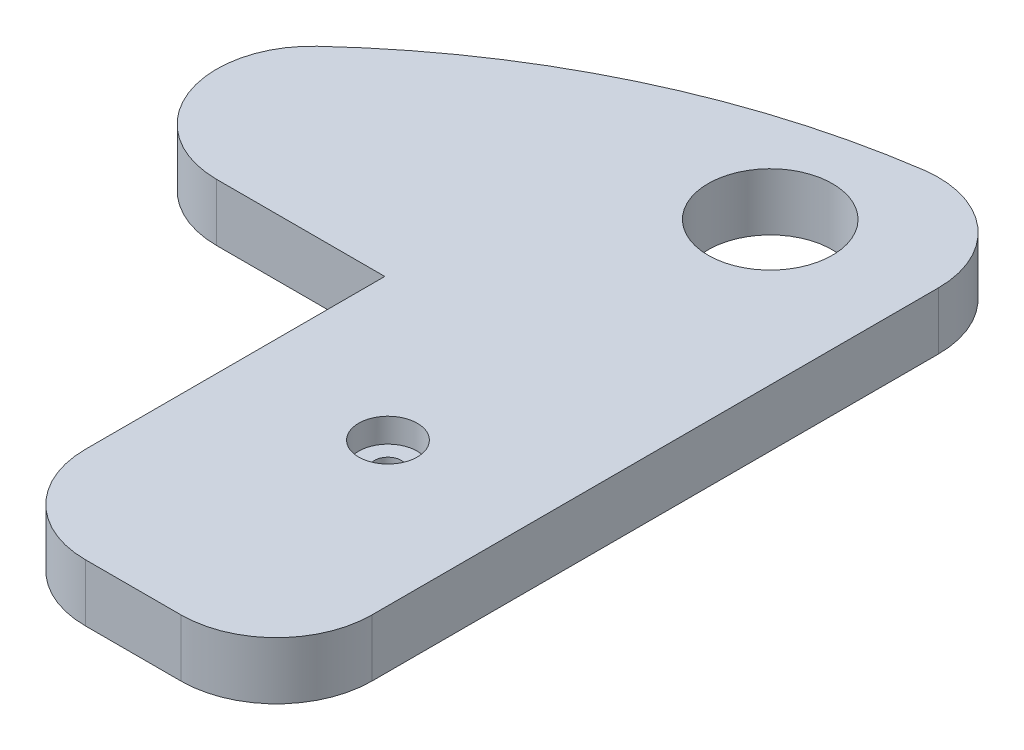
ISO-10303-21;
HEADER;
FILE_DESCRIPTION(('STEP AP214'),'2;1');
FILE_NAME('part.step','',(''),(''),'','','');
FILE_SCHEMA(('AUTOMOTIVE_DESIGN { 1 0 10303 214 1 1 1 1 }'));
ENDSEC;
DATA;
#1=APPLICATION_CONTEXT('core data for automotive mechanical design processes');
#2=APPLICATION_PROTOCOL_DEFINITION('international standard','automotive_design',2000,#1);
#3=PRODUCT_CONTEXT('',#1,'mechanical');
#4=PRODUCT('Part','Part','',(#3));
#5=PRODUCT_RELATED_PRODUCT_CATEGORY('part','',(#4));
#6=PRODUCT_DEFINITION_FORMATION('','',#4);
#7=PRODUCT_DEFINITION_CONTEXT('part definition',#1,'design');
#8=PRODUCT_DEFINITION('design','',#6,#7);
#9=PRODUCT_DEFINITION_SHAPE('','',#8);
#10=(LENGTH_UNIT() NAMED_UNIT(*) SI_UNIT(.MILLI.,.METRE.));
#11=(NAMED_UNIT(*) PLANE_ANGLE_UNIT() SI_UNIT($,.RADIAN.));
#12=(NAMED_UNIT(*) SI_UNIT($,.STERADIAN.) SOLID_ANGLE_UNIT());
#13=UNCERTAINTY_MEASURE_WITH_UNIT(LENGTH_MEASURE(1.E-05),#10,'distance_accuracy_value','');
#14=(GEOMETRIC_REPRESENTATION_CONTEXT(3) GLOBAL_UNCERTAINTY_ASSIGNED_CONTEXT((#13)) GLOBAL_UNIT_ASSIGNED_CONTEXT((#10,
#11,#12)) REPRESENTATION_CONTEXT('',''));
#15=CARTESIAN_POINT('',(0.,0.,0.));
#16=DIRECTION('',(0.,0.,1.));
#17=DIRECTION('',(1.,0.,0.));
#18=AXIS2_PLACEMENT_3D('',#15,#16,#17);
#19=CARTESIAN_POINT('',(-11.25,4.5,30.));
#20=DIRECTION('',(0.,0.,-1.));
#21=DIRECTION('',(-1.,0.,0.));
#22=AXIS2_PLACEMENT_3D('',#19,#20,#21);
#23=PLANE('',#22);
#24=DIRECTION('',(1.,0.,0.));
#25=VECTOR('',#24,1.);
#26=CARTESIAN_POINT('',(-11.25,0.,30.));
#27=LINE('',#26,#25);
#28=CARTESIAN_POINT('',(-3.75,0.,30.));
#29=VERTEX_POINT('',#28);
#30=CARTESIAN_POINT('',(3.74999999999999,0.,30.));
#31=VERTEX_POINT('',#30);
#32=EDGE_CURVE('E342',#29,#31,#27,.T.);
#33=ORIENTED_EDGE('',*,*,#32,.T.);
#34=DIRECTION('',(0.,-1.,0.));
#35=VECTOR('',#34,1.);
#36=CARTESIAN_POINT('',(3.75,4.5,30.));
#37=LINE('',#36,#35);
#38=CARTESIAN_POINT('',(3.74999999999999,4.5,30.));
#39=VERTEX_POINT('',#38);
#40=EDGE_CURVE('E48',#31,#39,#37,.F.);
#41=ORIENTED_EDGE('',*,*,#40,.T.);
#42=DIRECTION('',(1.,0.,0.));
#43=VECTOR('',#42,1.);
#44=CARTESIAN_POINT('',(-11.25,4.5,30.));
#45=LINE('',#44,#43);
#46=CARTESIAN_POINT('',(-3.75,4.5,30.));
#47=VERTEX_POINT('',#46);
#48=EDGE_CURVE('E341',#47,#39,#45,.T.);
#49=ORIENTED_EDGE('',*,*,#48,.F.);
#50=DIRECTION('',(0.,1.,0.));
#51=VECTOR('',#50,1.);
#52=CARTESIAN_POINT('',(-3.75,0.,30.));
#53=LINE('',#52,#51);
#54=EDGE_CURVE('E411',#47,#29,#53,.F.);
#55=ORIENTED_EDGE('',*,*,#54,.T.);
#56=EDGE_LOOP('',(#33,#41,#49,#55));
#57=FACE_BOUND('',#56,.T.);
#58=ADVANCED_FACE('F40',(#57),#23,.F.);
#59=CARTESIAN_POINT('',(0.,4.5,0.));
#60=DIRECTION('',(0.,-1.,0.));
#61=DIRECTION('',(0.,0.,-1.));
#62=AXIS2_PLACEMENT_3D('',#59,#60,#61);
#63=PLANE('',#62);
#64=CARTESIAN_POINT('',(0.,4.5,10.));
#65=DIRECTION('',(0.,1.,0.));
#66=DIRECTION('',(0.,0.,1.));
#67=AXIS2_PLACEMENT_3D('',#64,#65,#66);
#68=CIRCLE('',#67,2.3);
#69=CARTESIAN_POINT('',(0.,4.5,12.3));
#70=VERTEX_POINT('',#69);
#71=EDGE_CURVE('E248',#70,#70,#68,.T.);
#72=ORIENTED_EDGE('',*,*,#71,.F.);
#73=EDGE_LOOP('',(#72));
#74=FACE_BOUND('',#73,.T.);
#75=CARTESIAN_POINT('',(0.,4.5,-20.));
#76=DIRECTION('',(0.,1.,0.));
#77=DIRECTION('',(0.,0.,1.));
#78=AXIS2_PLACEMENT_3D('',#75,#76,#77);
#79=CIRCLE('',#78,4.875);
#80=CARTESIAN_POINT('',(0.,4.5,-15.125));
#81=VERTEX_POINT('',#80);
#82=EDGE_CURVE('E231',#81,#81,#79,.T.);
#83=ORIENTED_EDGE('',*,*,#82,.F.);
#84=EDGE_LOOP('',(#83));
#85=FACE_BOUND('',#84,.T.);
#86=DIRECTION('',(0.,0.,-1.));
#87=VECTOR('',#86,1.);
#88=CARTESIAN_POINT('',(11.25,4.5,30.));
#89=LINE('',#88,#87);
#90=CARTESIAN_POINT('',(11.25,4.5,22.5));
#91=VERTEX_POINT('',#90);
#92=CARTESIAN_POINT('',(11.25,4.5,-21.9615242270663));
#93=VERTEX_POINT('',#92);
#94=EDGE_CURVE('E339',#91,#93,#89,.T.);
#95=ORIENTED_EDGE('',*,*,#94,.T.);
#96=CARTESIAN_POINT('',(3.75,4.5,-21.9615242270663));
#97=DIRECTION('',(0.,-1.,0.));
#98=DIRECTION('',(0.,0.,-1.));
#99=AXIS2_PLACEMENT_3D('',#96,#97,#98);
#100=CIRCLE('',#99,7.5);
#101=CARTESIAN_POINT('',(2.67857142857143,4.5,-29.3845991166472));
#102=VERTEX_POINT('',#101);
#103=EDGE_CURVE('E409',#93,#102,#100,.F.);
#104=ORIENTED_EDGE('',*,*,#103,.T.);
#105=CARTESIAN_POINT('',(11.25,4.5,30.));
#106=DIRECTION('',(0.,1.,0.));
#107=DIRECTION('',(0.,0.,1.));
#108=AXIS2_PLACEMENT_3D('',#105,#106,#107);
#109=CIRCLE('',#108,60.);
#110=CARTESIAN_POINT('',(-29.5421561087423,4.5,-14.));
#111=VERTEX_POINT('',#110);
#112=EDGE_CURVE('E238',#102,#111,#109,.T.);
#113=ORIENTED_EDGE('',*,*,#112,.T.);
#114=CARTESIAN_POINT('',(-24.4431365951495,4.5,-8.49999999999999));
#115=DIRECTION('',(0.,-1.,0.));
#116=DIRECTION('',(0.,0.,-1.));
#117=AXIS2_PLACEMENT_3D('',#114,#115,#116);
#118=CIRCLE('',#117,7.5);
#119=CARTESIAN_POINT('',(-24.4431365951495,4.5,-0.999999999999994));
#120=VERTEX_POINT('',#119);
#121=EDGE_CURVE('E212',#111,#120,#118,.F.);
#122=ORIENTED_EDGE('',*,*,#121,.T.);
#123=DIRECTION('',(1.,0.,0.));
#124=VECTOR('',#123,1.);
#125=CARTESIAN_POINT('',(0.,4.5,-0.999999999999994));
#126=LINE('',#125,#124);
#127=CARTESIAN_POINT('',(-11.25,4.5,-0.999999999999994));
#128=VERTEX_POINT('',#127);
#129=EDGE_CURVE('E205',#120,#128,#126,.T.);
#130=ORIENTED_EDGE('',*,*,#129,.T.);
#131=DIRECTION('',(0.,0.,1.));
#132=VECTOR('',#131,1.);
#133=CARTESIAN_POINT('',(-11.25,4.5,0.));
#134=LINE('',#133,#132);
#135=CARTESIAN_POINT('',(-11.25,4.5,22.5));
#136=VERTEX_POINT('',#135);
#137=EDGE_CURVE('E210',#128,#136,#134,.T.);
#138=ORIENTED_EDGE('',*,*,#137,.T.);
#139=CARTESIAN_POINT('',(-3.75,4.5,22.5));
#140=DIRECTION('',(0.,-1.,0.));
#141=DIRECTION('',(0.,0.,-1.));
#142=AXIS2_PLACEMENT_3D('',#139,#140,#141);
#143=CIRCLE('',#142,7.5);
#144=EDGE_CURVE('E61',#136,#47,#143,.F.);
#145=ORIENTED_EDGE('',*,*,#144,.T.);
#146=ORIENTED_EDGE('',*,*,#48,.T.);
#147=CARTESIAN_POINT('',(3.75,4.5,22.5));
#148=DIRECTION('',(0.,-1.,0.));
#149=DIRECTION('',(0.,0.,-1.));
#150=AXIS2_PLACEMENT_3D('',#147,#148,#149);
#151=CIRCLE('',#150,7.5);
#152=EDGE_CURVE('E407',#39,#91,#151,.F.);
#153=ORIENTED_EDGE('',*,*,#152,.T.);
#154=EDGE_LOOP('',(#95,#104,#113,#122,#130,#138,#145,#146,#153));
#155=FACE_BOUND('',#154,.T.);
#156=ADVANCED_FACE('F208',(#74,#85,#155),#63,.F.);
#157=CARTESIAN_POINT('',(0.,0.,0.));
#158=DIRECTION('',(0.,-1.,0.));
#159=DIRECTION('',(0.,0.,-1.));
#160=AXIS2_PLACEMENT_3D('',#157,#158,#159);
#161=PLANE('',#160);
#162=CARTESIAN_POINT('',(0.,0.,-20.));
#163=DIRECTION('',(0.,-1.,0.));
#164=DIRECTION('',(0.,0.,-1.));
#165=AXIS2_PLACEMENT_3D('',#162,#163,#164);
#166=CIRCLE('',#165,4.875);
#167=CARTESIAN_POINT('',(0.,0.,-15.125));
#168=VERTEX_POINT('',#167);
#169=EDGE_CURVE('E235',#168,#168,#166,.F.);
#170=ORIENTED_EDGE('',*,*,#169,.T.);
#171=EDGE_LOOP('',(#170));
#172=FACE_BOUND('',#171,.T.);
#173=DIRECTION('',(-1.,0.,0.));
#174=VECTOR('',#173,1.);
#175=CARTESIAN_POINT('',(-7.24233902206816,0.,12.25));
#176=LINE('',#175,#174);
#177=CARTESIAN_POINT('',(-4.19869740362329,0.,12.25));
#178=VERTEX_POINT('',#177);
#179=CARTESIAN_POINT('',(-7.24233902206816,0.,12.25));
#180=VERTEX_POINT('',#179);
#181=EDGE_CURVE('E304',#178,#180,#176,.T.);
#182=ORIENTED_EDGE('',*,*,#181,.F.);
#183=CARTESIAN_POINT('',(-4.19869740362329,0.,13.25));
#184=DIRECTION('',(0.,-1.,0.));
#185=DIRECTION('',(0.,0.,-1.));
#186=AXIS2_PLACEMENT_3D('',#183,#184,#185);
#187=CIRCLE('',#186,1.);
#188=CARTESIAN_POINT('',(-3.20250270553154,0.,13.1628442572524));
#189=VERTEX_POINT('',#188);
#190=EDGE_CURVE('E356',#178,#189,#187,.T.);
#191=ORIENTED_EDGE('',*,*,#190,.T.);
#192=DIRECTION('',(-0.0871557427476553,0.,-0.996194698091746));
#193=VECTOR('',#192,1.);
#194=CARTESIAN_POINT('',(-3.28236622960586,0.,12.25));
#195=LINE('',#194,#193);
#196=CARTESIAN_POINT('',(-2.25,0.,24.05));
#197=VERTEX_POINT('',#196);
#198=EDGE_CURVE('E301',#197,#189,#195,.T.);
#199=ORIENTED_EDGE('',*,*,#198,.F.);
#200=CARTESIAN_POINT('',(0.,0.,24.05));
#201=DIRECTION('',(0.,-1.,0.));
#202=DIRECTION('',(0.,0.,-1.));
#203=AXIS2_PLACEMENT_3D('',#200,#201,#202);
#204=CIRCLE('',#203,2.25);
#205=CARTESIAN_POINT('',(2.25,0.,24.05));
#206=VERTEX_POINT('',#205);
#207=EDGE_CURVE('E298',#206,#197,#204,.T.);
#208=ORIENTED_EDGE('',*,*,#207,.F.);
#209=DIRECTION('',(-0.0871557427476538,0.,0.996194698091746));
#210=VECTOR('',#209,1.);
#211=CARTESIAN_POINT('',(3.28236622960585,0.,12.25));
#212=LINE('',#211,#210);
#213=CARTESIAN_POINT('',(3.20250270553153,0.,13.1628442572524));
#214=VERTEX_POINT('',#213);
#215=EDGE_CURVE('E296',#214,#206,#212,.T.);
#216=ORIENTED_EDGE('',*,*,#215,.F.);
#217=CARTESIAN_POINT('',(4.19869740362328,0.,13.25));
#218=DIRECTION('',(0.,-1.,0.));
#219=DIRECTION('',(0.,0.,-1.));
#220=AXIS2_PLACEMENT_3D('',#217,#218,#219);
#221=CIRCLE('',#220,1.);
#222=CARTESIAN_POINT('',(4.19869740362328,0.,12.25));
#223=VERTEX_POINT('',#222);
#224=EDGE_CURVE('E350',#214,#223,#221,.T.);
#225=ORIENTED_EDGE('',*,*,#224,.T.);
#226=DIRECTION('',(-1.,0.,0.));
#227=VECTOR('',#226,1.);
#228=CARTESIAN_POINT('',(7.24233902206817,0.,12.25));
#229=LINE('',#228,#227);
#230=CARTESIAN_POINT('',(7.24233902206817,0.,12.25));
#231=VERTEX_POINT('',#230);
#232=EDGE_CURVE('E293',#231,#223,#229,.T.);
#233=ORIENTED_EDGE('',*,*,#232,.F.);
#234=CARTESIAN_POINT('',(7.24233902206817,0.,10.));
#235=DIRECTION('',(0.,-1.,0.));
#236=DIRECTION('',(0.,0.,-1.));
#237=AXIS2_PLACEMENT_3D('',#234,#235,#236);
#238=CIRCLE('',#237,2.25);
#239=CARTESIAN_POINT('',(7.24233902206817,0.,7.75000000000001));
#240=VERTEX_POINT('',#239);
#241=EDGE_CURVE('E290',#240,#231,#238,.T.);
#242=ORIENTED_EDGE('',*,*,#241,.F.);
#243=DIRECTION('',(1.,0.,0.));
#244=VECTOR('',#243,1.);
#245=CARTESIAN_POINT('',(3.49233902206817,0.,7.75000000000001));
#246=LINE('',#245,#244);
#247=CARTESIAN_POINT('',(4.40867019608559,0.,7.75000000000001));
#248=VERTEX_POINT('',#247);
#249=EDGE_CURVE('E254',#248,#240,#246,.T.);
#250=ORIENTED_EDGE('',*,*,#249,.F.);
#251=CARTESIAN_POINT('',(4.40867019608559,0.,6.75000000000001));
#252=DIRECTION('',(0.,-1.,0.));
#253=DIRECTION('',(0.,0.,-1.));
#254=AXIS2_PLACEMENT_3D('',#251,#252,#253);
#255=CIRCLE('',#254,1.);
#256=CARTESIAN_POINT('',(3.41247549799385,0.,6.83715574274767));
#257=VERTEX_POINT('',#256);
#258=EDGE_CURVE('E352',#248,#257,#255,.T.);
#259=ORIENTED_EDGE('',*,*,#258,.T.);
#260=DIRECTION('',(0.0871557427476615,0.,0.996194698091745));
#261=VECTOR('',#260,1.);
#262=CARTESIAN_POINT('',(3.49233902206817,0.,7.75000000000001));
#263=LINE('',#262,#261);
#264=CARTESIAN_POINT('',(2.25,0.,-6.45));
#265=VERTEX_POINT('',#264);
#266=EDGE_CURVE('E258',#265,#257,#263,.T.);
#267=ORIENTED_EDGE('',*,*,#266,.F.);
#268=CARTESIAN_POINT('',(0.,0.,-6.44999999999999));
#269=DIRECTION('',(0.,-1.,0.));
#270=DIRECTION('',(0.,0.,-1.));
#271=AXIS2_PLACEMENT_3D('',#268,#269,#270);
#272=CIRCLE('',#271,2.25);
#273=CARTESIAN_POINT('',(-2.25,0.,-6.45));
#274=VERTEX_POINT('',#273);
#275=EDGE_CURVE('E314',#274,#265,#272,.T.);
#276=ORIENTED_EDGE('',*,*,#275,.F.);
#277=DIRECTION('',(0.0871557427476544,0.,-0.996194698091746));
#278=VECTOR('',#277,1.);
#279=CARTESIAN_POINT('',(-2.25,0.,-6.45));
#280=LINE('',#279,#278);
#281=CARTESIAN_POINT('',(-3.41247549799374,0.,6.83715574274766));
#282=VERTEX_POINT('',#281);
#283=EDGE_CURVE('E312',#282,#274,#280,.T.);
#284=ORIENTED_EDGE('',*,*,#283,.F.);
#285=CARTESIAN_POINT('',(-4.40867019608549,0.,6.75000000000001));
#286=DIRECTION('',(0.,-1.,0.));
#287=DIRECTION('',(0.,0.,-1.));
#288=AXIS2_PLACEMENT_3D('',#285,#286,#287);
#289=CIRCLE('',#288,1.);
#290=CARTESIAN_POINT('',(-4.40867019608549,0.,7.75));
#291=VERTEX_POINT('',#290);
#292=EDGE_CURVE('E354',#282,#291,#289,.T.);
#293=ORIENTED_EDGE('',*,*,#292,.T.);
#294=DIRECTION('',(1.,0.,0.));
#295=VECTOR('',#294,1.);
#296=CARTESIAN_POINT('',(-3.49233902206806,0.,7.75));
#297=LINE('',#296,#295);
#298=CARTESIAN_POINT('',(-7.24233902206816,0.,7.75000000000001));
#299=VERTEX_POINT('',#298);
#300=EDGE_CURVE('E309',#299,#291,#297,.T.);
#301=ORIENTED_EDGE('',*,*,#300,.F.);
#302=CARTESIAN_POINT('',(-7.24233902206816,0.,10.));
#303=DIRECTION('',(0.,-1.,0.));
#304=DIRECTION('',(0.,0.,-1.));
#305=AXIS2_PLACEMENT_3D('',#302,#303,#304);
#306=CIRCLE('',#305,2.25);
#307=EDGE_CURVE('E306',#180,#299,#306,.T.);
#308=ORIENTED_EDGE('',*,*,#307,.F.);
#309=EDGE_LOOP('',(#182,#191,#199,#208,#216,#225,#233,#242,#250,#259,#267,#276,#284,#293,#301,#308));
#310=FACE_BOUND('',#309,.T.);
#311=CARTESIAN_POINT('',(11.25,0.,30.));
#312=DIRECTION('',(0.,-1.,0.));
#313=DIRECTION('',(0.,0.,-1.));
#314=AXIS2_PLACEMENT_3D('',#311,#312,#313);
#315=CIRCLE('',#314,60.);
#316=CARTESIAN_POINT('',(2.67857142857143,0.,-29.3845991166472));
#317=VERTEX_POINT('',#316);
#318=CARTESIAN_POINT('',(-29.5421561087423,0.,-14.));
#319=VERTEX_POINT('',#318);
#320=EDGE_CURVE('E240',#317,#319,#315,.F.);
#321=ORIENTED_EDGE('',*,*,#320,.F.);
#322=CARTESIAN_POINT('',(3.75,0.,-21.9615242270663));
#323=DIRECTION('',(0.,-1.,0.));
#324=DIRECTION('',(0.,0.,-1.));
#325=AXIS2_PLACEMENT_3D('',#322,#323,#324);
#326=CIRCLE('',#325,7.5);
#327=CARTESIAN_POINT('',(11.25,0.,-21.9615242270663));
#328=VERTEX_POINT('',#327);
#329=EDGE_CURVE('E399',#317,#328,#326,.T.);
#330=ORIENTED_EDGE('',*,*,#329,.T.);
#331=DIRECTION('',(0.,0.,-1.));
#332=VECTOR('',#331,1.);
#333=CARTESIAN_POINT('',(11.25,0.,30.));
#334=LINE('',#333,#332);
#335=CARTESIAN_POINT('',(11.25,0.,22.5));
#336=VERTEX_POINT('',#335);
#337=EDGE_CURVE('E321',#336,#328,#334,.T.);
#338=ORIENTED_EDGE('',*,*,#337,.F.);
#339=CARTESIAN_POINT('',(3.75,0.,22.5));
#340=DIRECTION('',(0.,-1.,0.));
#341=DIRECTION('',(0.,0.,-1.));
#342=AXIS2_PLACEMENT_3D('',#339,#340,#341);
#343=CIRCLE('',#342,7.5);
#344=EDGE_CURVE('E397',#336,#31,#343,.T.);
#345=ORIENTED_EDGE('',*,*,#344,.T.);
#346=ORIENTED_EDGE('',*,*,#32,.F.);
#347=CARTESIAN_POINT('',(-3.75,0.,22.5));
#348=DIRECTION('',(0.,-1.,0.));
#349=DIRECTION('',(0.,0.,-1.));
#350=AXIS2_PLACEMENT_3D('',#347,#348,#349);
#351=CIRCLE('',#350,7.5);
#352=CARTESIAN_POINT('',(-11.25,0.,22.5));
#353=VERTEX_POINT('',#352);
#354=EDGE_CURVE('E395',#29,#353,#351,.T.);
#355=ORIENTED_EDGE('',*,*,#354,.T.);
#356=DIRECTION('',(0.,0.,1.));
#357=VECTOR('',#356,1.);
#358=CARTESIAN_POINT('',(-11.25,0.,0.));
#359=LINE('',#358,#357);
#360=CARTESIAN_POINT('',(-11.25,0.,-0.999999999999994));
#361=VERTEX_POINT('',#360);
#362=EDGE_CURVE('E229',#361,#353,#359,.T.);
#363=ORIENTED_EDGE('',*,*,#362,.F.);
#364=DIRECTION('',(1.,0.,0.));
#365=VECTOR('',#364,1.);
#366=CARTESIAN_POINT('',(0.,0.,-0.999999999999994));
#367=LINE('',#366,#365);
#368=CARTESIAN_POINT('',(-24.4431365951495,0.,-0.999999999999994));
#369=VERTEX_POINT('',#368);
#370=EDGE_CURVE('E215',#369,#361,#367,.T.);
#371=ORIENTED_EDGE('',*,*,#370,.F.);
#372=CARTESIAN_POINT('',(-24.4431365951495,0.,-8.49999999999999));
#373=DIRECTION('',(0.,-1.,0.));
#374=DIRECTION('',(0.,0.,-1.));
#375=AXIS2_PLACEMENT_3D('',#372,#373,#374);
#376=CIRCLE('',#375,7.5);
#377=EDGE_CURVE('E389',#369,#319,#376,.T.);
#378=ORIENTED_EDGE('',*,*,#377,.T.);
#379=EDGE_LOOP('',(#321,#330,#338,#345,#346,#355,#363,#371,#378));
#380=FACE_BOUND('',#379,.T.);
#381=ADVANCED_FACE('F418',(#172,#310,#380),#161,.T.);
#382=CARTESIAN_POINT('',(11.25,-67.0820393249937,30.));
#383=DIRECTION('',(0.,1.,0.));
#384=DIRECTION('',(0.,0.,1.));
#385=AXIS2_PLACEMENT_3D('',#382,#383,#384);
#386=CYLINDRICAL_SURFACE('',#385,60.);
#387=ORIENTED_EDGE('',*,*,#112,.F.);
#388=DIRECTION('',(0.,1.,0.));
#389=VECTOR('',#388,1.);
#390=CARTESIAN_POINT('',(2.67857142857143,-67.0820393249937,-29.3845991166472));
#391=LINE('',#390,#389);
#392=EDGE_CURVE('E392',#102,#317,#391,.F.);
#393=ORIENTED_EDGE('',*,*,#392,.T.);
#394=ORIENTED_EDGE('',*,*,#320,.T.);
#395=DIRECTION('',(0.,1.,0.));
#396=VECTOR('',#395,1.);
#397=CARTESIAN_POINT('',(-29.5421561087423,-67.0820393249937,-14.));
#398=LINE('',#397,#396);
#399=EDGE_CURVE('E383',#319,#111,#398,.T.);
#400=ORIENTED_EDGE('',*,*,#399,.T.);
#401=EDGE_LOOP('',(#387,#393,#394,#400));
#402=FACE_BOUND('',#401,.T.);
#403=ADVANCED_FACE('F440',(#402),#386,.T.);
#404=CARTESIAN_POINT('',(11.25,4.5,30.));
#405=DIRECTION('',(-1.,0.,0.));
#406=DIRECTION('',(0.,0.,1.));
#407=AXIS2_PLACEMENT_3D('',#404,#405,#406);
#408=PLANE('',#407);
#409=ORIENTED_EDGE('',*,*,#337,.T.);
#410=DIRECTION('',(0.,-1.,0.));
#411=VECTOR('',#410,1.);
#412=CARTESIAN_POINT('',(11.25,4.5,-21.9615242270663));
#413=LINE('',#412,#411);
#414=EDGE_CURVE('E404',#328,#93,#413,.F.);
#415=ORIENTED_EDGE('',*,*,#414,.T.);
#416=ORIENTED_EDGE('',*,*,#94,.F.);
#417=DIRECTION('',(0.,-1.,0.));
#418=VECTOR('',#417,1.);
#419=CARTESIAN_POINT('',(11.25,4.5,22.5));
#420=LINE('',#419,#418);
#421=EDGE_CURVE('E401',#91,#336,#420,.T.);
#422=ORIENTED_EDGE('',*,*,#421,.T.);
#423=EDGE_LOOP('',(#409,#415,#416,#422));
#424=FACE_BOUND('',#423,.T.);
#425=ADVANCED_FACE('F436',(#424),#408,.F.);
#426=CARTESIAN_POINT('',(3.49233902206817,1.6,7.75000000000001));
#427=DIRECTION('',(0.,0.,-1.));
#428=DIRECTION('',(-1.,0.,0.));
#429=AXIS2_PLACEMENT_3D('',#426,#427,#428);
#430=PLANE('',#429);
#431=DIRECTION('',(1.,0.,0.));
#432=VECTOR('',#431,1.);
#433=CARTESIAN_POINT('',(3.49233902206817,1.6,7.75000000000001));
#434=LINE('',#433,#432);
#435=CARTESIAN_POINT('',(4.40867019608559,1.6,7.75000000000001));
#436=VERTEX_POINT('',#435);
#437=CARTESIAN_POINT('',(7.24233902206817,1.6,7.75000000000001));
#438=VERTEX_POINT('',#437);
#439=EDGE_CURVE('E255',#436,#438,#434,.T.);
#440=ORIENTED_EDGE('',*,*,#439,.F.);
#441=DIRECTION('',(0.,-1.,0.));
#442=VECTOR('',#441,1.);
#443=CARTESIAN_POINT('',(4.40867019608559,1.6,7.75000000000001));
#444=LINE('',#443,#442);
#445=EDGE_CURVE('E365',#436,#248,#444,.T.);
#446=ORIENTED_EDGE('',*,*,#445,.T.);
#447=ORIENTED_EDGE('',*,*,#249,.T.);
#448=DIRECTION('',(0.,-1.,0.));
#449=VECTOR('',#448,1.);
#450=CARTESIAN_POINT('',(7.24233902206817,1.6,7.75000000000001));
#451=LINE('',#450,#449);
#452=EDGE_CURVE('E288',#438,#240,#451,.T.);
#453=ORIENTED_EDGE('',*,*,#452,.F.);
#454=EDGE_LOOP('',(#440,#446,#447,#453));
#455=FACE_BOUND('',#454,.T.);
#456=ADVANCED_FACE('F439',(#455),#430,.F.);
#457=CARTESIAN_POINT('',(3.49233902206817,1.6,7.75000000000001));
#458=DIRECTION('',(0.996194698091745,0.,-0.0871557427476615));
#459=DIRECTION('',(-0.0871557427476615,0.,-0.996194698091745));
#460=AXIS2_PLACEMENT_3D('',#457,#458,#459);
#461=PLANE('',#460);
#462=ORIENTED_EDGE('',*,*,#266,.T.);
#463=DIRECTION('',(0.,-1.,0.));
#464=VECTOR('',#463,1.);
#465=CARTESIAN_POINT('',(3.41247549799385,1.6,6.83715574274767));
#466=LINE('',#465,#464);
#467=CARTESIAN_POINT('',(3.41247549799385,1.6,6.83715574274767));
#468=VERTEX_POINT('',#467);
#469=EDGE_CURVE('E368',#257,#468,#466,.F.);
#470=ORIENTED_EDGE('',*,*,#469,.T.);
#471=DIRECTION('',(0.0871557427476615,0.,0.996194698091745));
#472=VECTOR('',#471,1.);
#473=CARTESIAN_POINT('',(3.49233902206817,1.6,7.75000000000001));
#474=LINE('',#473,#472);
#475=CARTESIAN_POINT('',(2.25,1.6,-6.45));
#476=VERTEX_POINT('',#475);
#477=EDGE_CURVE('E285',#476,#468,#474,.T.);
#478=ORIENTED_EDGE('',*,*,#477,.F.);
#479=DIRECTION('',(0.,-1.,0.));
#480=VECTOR('',#479,1.);
#481=CARTESIAN_POINT('',(2.25,1.6,-6.45));
#482=LINE('',#481,#480);
#483=EDGE_CURVE('E319',#476,#265,#482,.T.);
#484=ORIENTED_EDGE('',*,*,#483,.T.);
#485=EDGE_LOOP('',(#462,#470,#478,#484));
#486=FACE_BOUND('',#485,.T.);
#487=ADVANCED_FACE('F503',(#486),#461,.F.);
#488=CARTESIAN_POINT('',(0.,1.6,-6.44999999999999));
#489=DIRECTION('',(0.,-1.,0.));
#490=DIRECTION('',(0.,0.,-1.));
#491=AXIS2_PLACEMENT_3D('',#488,#489,#490);
#492=CYLINDRICAL_SURFACE('',#491,2.25);
#493=ORIENTED_EDGE('',*,*,#275,.T.);
#494=ORIENTED_EDGE('',*,*,#483,.F.);
#495=CARTESIAN_POINT('',(0.,1.6,-6.44999999999999));
#496=DIRECTION('',(0.,-1.,0.));
#497=DIRECTION('',(0.,0.,-1.));
#498=AXIS2_PLACEMENT_3D('',#495,#496,#497);
#499=CIRCLE('',#498,2.25);
#500=CARTESIAN_POINT('',(-2.25,1.6,-6.45));
#501=VERTEX_POINT('',#500);
#502=EDGE_CURVE('E282',#501,#476,#499,.T.);
#503=ORIENTED_EDGE('',*,*,#502,.F.);
#504=DIRECTION('',(0.,-1.,0.));
#505=VECTOR('',#504,1.);
#506=CARTESIAN_POINT('',(-2.25,1.6,-6.45));
#507=LINE('',#506,#505);
#508=EDGE_CURVE('E322',#501,#274,#507,.T.);
#509=ORIENTED_EDGE('',*,*,#508,.T.);
#510=EDGE_LOOP('',(#493,#494,#503,#509));
#511=FACE_BOUND('',#510,.T.);
#512=ADVANCED_FACE('F506',(#511),#492,.F.);
#513=CARTESIAN_POINT('',(-2.25,1.6,-6.45));
#514=DIRECTION('',(-0.996194698091746,0.,-0.0871557427476544));
#515=DIRECTION('',(-0.0871557427476544,0.,0.996194698091746));
#516=AXIS2_PLACEMENT_3D('',#513,#514,#515);
#517=PLANE('',#516);
#518=DIRECTION('',(0.0871557427476544,0.,-0.996194698091746));
#519=VECTOR('',#518,1.);
#520=CARTESIAN_POINT('',(-2.25,1.6,-6.45));
#521=LINE('',#520,#519);
#522=CARTESIAN_POINT('',(-3.41247549799374,1.6,6.83715574274766));
#523=VERTEX_POINT('',#522);
#524=EDGE_CURVE('E280',#523,#501,#521,.T.);
#525=ORIENTED_EDGE('',*,*,#524,.F.);
#526=DIRECTION('',(0.,-1.,0.));
#527=VECTOR('',#526,1.);
#528=CARTESIAN_POINT('',(-3.41247549799374,1.6,6.83715574274766));
#529=LINE('',#528,#527);
#530=EDGE_CURVE('E360',#523,#282,#529,.T.);
#531=ORIENTED_EDGE('',*,*,#530,.T.);
#532=ORIENTED_EDGE('',*,*,#283,.T.);
#533=ORIENTED_EDGE('',*,*,#508,.F.);
#534=EDGE_LOOP('',(#525,#531,#532,#533));
#535=FACE_BOUND('',#534,.T.);
#536=ADVANCED_FACE('F510',(#535),#517,.F.);
#537=CARTESIAN_POINT('',(-3.49233902206806,1.6,7.75));
#538=DIRECTION('',(0.,0.,-1.));
#539=DIRECTION('',(-1.,0.,0.));
#540=AXIS2_PLACEMENT_3D('',#537,#538,#539);
#541=PLANE('',#540);
#542=ORIENTED_EDGE('',*,*,#300,.T.);
#543=DIRECTION('',(0.,-1.,0.));
#544=VECTOR('',#543,1.);
#545=CARTESIAN_POINT('',(-4.40867019608549,1.6,7.75));
#546=LINE('',#545,#544);
#547=CARTESIAN_POINT('',(-4.40867019608549,1.6,7.75));
#548=VERTEX_POINT('',#547);
#549=EDGE_CURVE('E363',#291,#548,#546,.F.);
#550=ORIENTED_EDGE('',*,*,#549,.T.);
#551=DIRECTION('',(1.,0.,0.));
#552=VECTOR('',#551,1.);
#553=CARTESIAN_POINT('',(-3.49233902206806,1.6,7.75));
#554=LINE('',#553,#552);
#555=CARTESIAN_POINT('',(-7.24233902206816,1.6,7.75000000000001));
#556=VERTEX_POINT('',#555);
#557=EDGE_CURVE('E277',#556,#548,#554,.T.);
#558=ORIENTED_EDGE('',*,*,#557,.F.);
#559=DIRECTION('',(0.,-1.,0.));
#560=VECTOR('',#559,1.);
#561=CARTESIAN_POINT('',(-7.24233902206816,1.6,7.75000000000001));
#562=LINE('',#561,#560);
#563=EDGE_CURVE('E325',#556,#299,#562,.T.);
#564=ORIENTED_EDGE('',*,*,#563,.T.);
#565=EDGE_LOOP('',(#542,#550,#558,#564));
#566=FACE_BOUND('',#565,.T.);
#567=ADVANCED_FACE('F514',(#566),#541,.F.);
#568=CARTESIAN_POINT('',(-7.24233902206816,1.6,10.));
#569=DIRECTION('',(0.,-1.,0.));
#570=DIRECTION('',(0.,0.,-1.));
#571=AXIS2_PLACEMENT_3D('',#568,#569,#570);
#572=CYLINDRICAL_SURFACE('',#571,2.25);
#573=ORIENTED_EDGE('',*,*,#307,.T.);
#574=ORIENTED_EDGE('',*,*,#563,.F.);
#575=CARTESIAN_POINT('',(-7.24233902206816,1.6,10.));
#576=DIRECTION('',(0.,-1.,0.));
#577=DIRECTION('',(0.,0.,-1.));
#578=AXIS2_PLACEMENT_3D('',#575,#576,#577);
#579=CIRCLE('',#578,2.25);
#580=CARTESIAN_POINT('',(-7.24233902206816,1.6,12.25));
#581=VERTEX_POINT('',#580);
#582=EDGE_CURVE('E274',#581,#556,#579,.T.);
#583=ORIENTED_EDGE('',*,*,#582,.F.);
#584=DIRECTION('',(0.,-1.,0.));
#585=VECTOR('',#584,1.);
#586=CARTESIAN_POINT('',(-7.24233902206816,1.6,12.25));
#587=LINE('',#586,#585);
#588=EDGE_CURVE('E327',#581,#180,#587,.T.);
#589=ORIENTED_EDGE('',*,*,#588,.T.);
#590=EDGE_LOOP('',(#573,#574,#583,#589));
#591=FACE_BOUND('',#590,.T.);
#592=ADVANCED_FACE('F518',(#591),#572,.F.);
#593=CARTESIAN_POINT('',(-7.24233902206816,1.6,12.25));
#594=DIRECTION('',(0.,0.,1.));
#595=DIRECTION('',(1.,0.,0.));
#596=AXIS2_PLACEMENT_3D('',#593,#594,#595);
#597=PLANE('',#596);
#598=DIRECTION('',(-1.,0.,0.));
#599=VECTOR('',#598,1.);
#600=CARTESIAN_POINT('',(-7.24233902206816,1.6,12.25));
#601=LINE('',#600,#599);
#602=CARTESIAN_POINT('',(-4.19869740362329,1.6,12.25));
#603=VERTEX_POINT('',#602);
#604=EDGE_CURVE('E272',#603,#581,#601,.T.);
#605=ORIENTED_EDGE('',*,*,#604,.F.);
#606=DIRECTION('',(0.,-1.,0.));
#607=VECTOR('',#606,1.);
#608=CARTESIAN_POINT('',(-4.19869740362329,1.6,12.25));
#609=LINE('',#608,#607);
#610=EDGE_CURVE('E344',#603,#178,#609,.T.);
#611=ORIENTED_EDGE('',*,*,#610,.T.);
#612=ORIENTED_EDGE('',*,*,#181,.T.);
#613=ORIENTED_EDGE('',*,*,#588,.F.);
#614=EDGE_LOOP('',(#605,#611,#612,#613));
#615=FACE_BOUND('',#614,.T.);
#616=ADVANCED_FACE('F522',(#615),#597,.F.);
#617=CARTESIAN_POINT('',(-3.28236622960586,1.6,12.25));
#618=DIRECTION('',(-0.996194698091746,0.,0.0871557427476553));
#619=DIRECTION('',(0.0871557427476553,0.,0.996194698091746));
#620=AXIS2_PLACEMENT_3D('',#617,#618,#619);
#621=PLANE('',#620);
#622=ORIENTED_EDGE('',*,*,#198,.T.);
#623=DIRECTION('',(0.,-1.,0.));
#624=VECTOR('',#623,1.);
#625=CARTESIAN_POINT('',(-3.20250270553154,1.6,13.1628442572524));
#626=LINE('',#625,#624);
#627=CARTESIAN_POINT('',(-3.20250270553154,1.6,13.1628442572524));
#628=VERTEX_POINT('',#627);
#629=EDGE_CURVE('E358',#189,#628,#626,.F.);
#630=ORIENTED_EDGE('',*,*,#629,.T.);
#631=DIRECTION('',(-0.0871557427476553,0.,-0.996194698091746));
#632=VECTOR('',#631,1.);
#633=CARTESIAN_POINT('',(-3.28236622960586,1.6,12.25));
#634=LINE('',#633,#632);
#635=CARTESIAN_POINT('',(-2.25,1.6,24.05));
#636=VERTEX_POINT('',#635);
#637=EDGE_CURVE('E269',#636,#628,#634,.T.);
#638=ORIENTED_EDGE('',*,*,#637,.F.);
#639=DIRECTION('',(0.,-1.,0.));
#640=VECTOR('',#639,1.);
#641=CARTESIAN_POINT('',(-2.25,1.6,24.05));
#642=LINE('',#641,#640);
#643=EDGE_CURVE('E330',#636,#197,#642,.T.);
#644=ORIENTED_EDGE('',*,*,#643,.T.);
#645=EDGE_LOOP('',(#622,#630,#638,#644));
#646=FACE_BOUND('',#645,.T.);
#647=ADVANCED_FACE('F526',(#646),#621,.F.);
#648=CARTESIAN_POINT('',(0.,1.6,24.05));
#649=DIRECTION('',(0.,-1.,0.));
#650=DIRECTION('',(0.,0.,-1.));
#651=AXIS2_PLACEMENT_3D('',#648,#649,#650);
#652=CYLINDRICAL_SURFACE('',#651,2.25);
#653=ORIENTED_EDGE('',*,*,#207,.T.);
#654=ORIENTED_EDGE('',*,*,#643,.F.);
#655=CARTESIAN_POINT('',(0.,1.6,24.05));
#656=DIRECTION('',(0.,-1.,0.));
#657=DIRECTION('',(0.,0.,-1.));
#658=AXIS2_PLACEMENT_3D('',#655,#656,#657);
#659=CIRCLE('',#658,2.25);
#660=CARTESIAN_POINT('',(2.25,1.6,24.05));
#661=VERTEX_POINT('',#660);
#662=EDGE_CURVE('E266',#661,#636,#659,.T.);
#663=ORIENTED_EDGE('',*,*,#662,.F.);
#664=DIRECTION('',(0.,-1.,0.));
#665=VECTOR('',#664,1.);
#666=CARTESIAN_POINT('',(2.25,1.6,24.05));
#667=LINE('',#666,#665);
#668=EDGE_CURVE('E332',#661,#206,#667,.T.);
#669=ORIENTED_EDGE('',*,*,#668,.T.);
#670=EDGE_LOOP('',(#653,#654,#663,#669));
#671=FACE_BOUND('',#670,.T.);
#672=ADVANCED_FACE('F530',(#671),#652,.F.);
#673=CARTESIAN_POINT('',(3.28236622960585,1.6,12.25));
#674=DIRECTION('',(0.996194698091746,0.,0.0871557427476538));
#675=DIRECTION('',(0.0871557427476538,0.,-0.996194698091746));
#676=AXIS2_PLACEMENT_3D('',#673,#674,#675);
#677=PLANE('',#676);
#678=DIRECTION('',(-0.0871557427476538,0.,0.996194698091746));
#679=VECTOR('',#678,1.);
#680=CARTESIAN_POINT('',(3.28236622960585,1.6,12.25));
#681=LINE('',#680,#679);
#682=CARTESIAN_POINT('',(3.20250270553153,1.6,13.1628442572524));
#683=VERTEX_POINT('',#682);
#684=EDGE_CURVE('E264',#683,#661,#681,.T.);
#685=ORIENTED_EDGE('',*,*,#684,.F.);
#686=DIRECTION('',(0.,-1.,0.));
#687=VECTOR('',#686,1.);
#688=CARTESIAN_POINT('',(3.20250270553153,1.6,13.1628442572524));
#689=LINE('',#688,#687);
#690=EDGE_CURVE('E370',#683,#214,#689,.T.);
#691=ORIENTED_EDGE('',*,*,#690,.T.);
#692=ORIENTED_EDGE('',*,*,#215,.T.);
#693=ORIENTED_EDGE('',*,*,#668,.F.);
#694=EDGE_LOOP('',(#685,#691,#692,#693));
#695=FACE_BOUND('',#694,.T.);
#696=ADVANCED_FACE('F534',(#695),#677,.F.);
#697=CARTESIAN_POINT('',(7.24233902206817,1.6,12.25));
#698=DIRECTION('',(0.,0.,1.));
#699=DIRECTION('',(1.,0.,0.));
#700=AXIS2_PLACEMENT_3D('',#697,#698,#699);
#701=PLANE('',#700);
#702=ORIENTED_EDGE('',*,*,#232,.T.);
#703=DIRECTION('',(0.,-1.,0.));
#704=VECTOR('',#703,1.);
#705=CARTESIAN_POINT('',(4.19869740362328,1.6,12.25));
#706=LINE('',#705,#704);
#707=CARTESIAN_POINT('',(4.19869740362328,1.6,12.25));
#708=VERTEX_POINT('',#707);
#709=EDGE_CURVE('E373',#223,#708,#706,.F.);
#710=ORIENTED_EDGE('',*,*,#709,.T.);
#711=DIRECTION('',(-1.,0.,0.));
#712=VECTOR('',#711,1.);
#713=CARTESIAN_POINT('',(7.24233902206817,1.6,12.25));
#714=LINE('',#713,#712);
#715=CARTESIAN_POINT('',(7.24233902206817,1.6,12.25));
#716=VERTEX_POINT('',#715);
#717=EDGE_CURVE('E261',#716,#708,#714,.T.);
#718=ORIENTED_EDGE('',*,*,#717,.F.);
#719=DIRECTION('',(0.,-1.,0.));
#720=VECTOR('',#719,1.);
#721=CARTESIAN_POINT('',(7.24233902206817,1.6,12.25));
#722=LINE('',#721,#720);
#723=EDGE_CURVE('E335',#716,#231,#722,.T.);
#724=ORIENTED_EDGE('',*,*,#723,.T.);
#725=EDGE_LOOP('',(#702,#710,#718,#724));
#726=FACE_BOUND('',#725,.T.);
#727=ADVANCED_FACE('F538',(#726),#701,.F.);
#728=CARTESIAN_POINT('',(7.24233902206817,1.6,10.));
#729=DIRECTION('',(0.,-1.,0.));
#730=DIRECTION('',(0.,0.,-1.));
#731=AXIS2_PLACEMENT_3D('',#728,#729,#730);
#732=CYLINDRICAL_SURFACE('',#731,2.25);
#733=ORIENTED_EDGE('',*,*,#241,.T.);
#734=ORIENTED_EDGE('',*,*,#723,.F.);
#735=CARTESIAN_POINT('',(7.24233902206817,1.6,10.));
#736=DIRECTION('',(0.,-1.,0.));
#737=DIRECTION('',(0.,0.,-1.));
#738=AXIS2_PLACEMENT_3D('',#735,#736,#737);
#739=CIRCLE('',#738,2.25);
#740=EDGE_CURVE('E257',#438,#716,#739,.T.);
#741=ORIENTED_EDGE('',*,*,#740,.F.);
#742=ORIENTED_EDGE('',*,*,#452,.T.);
#743=EDGE_LOOP('',(#733,#734,#741,#742));
#744=FACE_BOUND('',#743,.T.);
#745=ADVANCED_FACE('F501',(#744),#732,.F.);
#746=CARTESIAN_POINT('',(7.24233902206817,1.6,10.));
#747=DIRECTION('',(0.,-1.,0.));
#748=DIRECTION('',(0.,0.,-1.));
#749=AXIS2_PLACEMENT_3D('',#746,#747,#748);
#750=PLANE('',#749);
#751=CARTESIAN_POINT('',(0.,1.6,10.));
#752=DIRECTION('',(0.,-1.,0.));
#753=DIRECTION('',(0.,0.,-1.));
#754=AXIS2_PLACEMENT_3D('',#751,#752,#753);
#755=CIRCLE('',#754,1.05);
#756=CARTESIAN_POINT('',(0.,1.6,8.95000000000001));
#757=VERTEX_POINT('',#756);
#758=EDGE_CURVE('E245',#757,#757,#755,.T.);
#759=ORIENTED_EDGE('',*,*,#758,.F.);
#760=EDGE_LOOP('',(#759));
#761=FACE_BOUND('',#760,.T.);
#762=ORIENTED_EDGE('',*,*,#477,.T.);
#763=CARTESIAN_POINT('',(4.40867019608559,1.6,6.75000000000001));
#764=DIRECTION('',(0.,-1.,0.));
#765=DIRECTION('',(0.,0.,-1.));
#766=AXIS2_PLACEMENT_3D('',#763,#764,#765);
#767=CIRCLE('',#766,1.);
#768=EDGE_CURVE('E379',#468,#436,#767,.F.);
#769=ORIENTED_EDGE('',*,*,#768,.T.);
#770=ORIENTED_EDGE('',*,*,#439,.T.);
#771=ORIENTED_EDGE('',*,*,#740,.T.);
#772=ORIENTED_EDGE('',*,*,#717,.T.);
#773=CARTESIAN_POINT('',(4.19869740362328,1.6,13.25));
#774=DIRECTION('',(0.,-1.,0.));
#775=DIRECTION('',(0.,0.,-1.));
#776=AXIS2_PLACEMENT_3D('',#773,#774,#775);
#777=CIRCLE('',#776,1.);
#778=EDGE_CURVE('E381',#708,#683,#777,.F.);
#779=ORIENTED_EDGE('',*,*,#778,.T.);
#780=ORIENTED_EDGE('',*,*,#684,.T.);
#781=ORIENTED_EDGE('',*,*,#662,.T.);
#782=ORIENTED_EDGE('',*,*,#637,.T.);
#783=CARTESIAN_POINT('',(-4.19869740362329,1.6,13.25));
#784=DIRECTION('',(0.,-1.,0.));
#785=DIRECTION('',(0.,0.,-1.));
#786=AXIS2_PLACEMENT_3D('',#783,#784,#785);
#787=CIRCLE('',#786,1.);
#788=EDGE_CURVE('E375',#628,#603,#787,.F.);
#789=ORIENTED_EDGE('',*,*,#788,.T.);
#790=ORIENTED_EDGE('',*,*,#604,.T.);
#791=ORIENTED_EDGE('',*,*,#582,.T.);
#792=ORIENTED_EDGE('',*,*,#557,.T.);
#793=CARTESIAN_POINT('',(-4.40867019608549,1.6,6.75000000000001));
#794=DIRECTION('',(0.,-1.,0.));
#795=DIRECTION('',(0.,0.,-1.));
#796=AXIS2_PLACEMENT_3D('',#793,#794,#795);
#797=CIRCLE('',#796,1.);
#798=EDGE_CURVE('E377',#548,#523,#797,.F.);
#799=ORIENTED_EDGE('',*,*,#798,.T.);
#800=ORIENTED_EDGE('',*,*,#524,.T.);
#801=ORIENTED_EDGE('',*,*,#502,.T.);
#802=EDGE_LOOP('',(#762,#769,#770,#771,#772,#779,#780,#781,#782,#789,#790,#791,#792,#799,#800,#801));
#803=FACE_BOUND('',#802,.T.);
#804=ADVANCED_FACE('F446',(#761,#803),#750,.T.);
#805=CARTESIAN_POINT('',(-4.19869740362329,1.6,13.25));
#806=DIRECTION('',(0.,-1.,0.));
#807=DIRECTION('',(0.,0.,-1.));
#808=AXIS2_PLACEMENT_3D('',#805,#806,#807);
#809=CYLINDRICAL_SURFACE('',#808,1.);
#810=ORIENTED_EDGE('',*,*,#788,.F.);
#811=ORIENTED_EDGE('',*,*,#629,.F.);
#812=ORIENTED_EDGE('',*,*,#190,.F.);
#813=ORIENTED_EDGE('',*,*,#610,.F.);
#814=EDGE_LOOP('',(#810,#811,#812,#813));
#815=FACE_BOUND('',#814,.T.);
#816=ADVANCED_FACE('F442',(#815),#809,.T.);
#817=CARTESIAN_POINT('',(-4.40867019608549,1.6,6.75000000000001));
#818=DIRECTION('',(0.,-1.,0.));
#819=DIRECTION('',(0.,0.,-1.));
#820=AXIS2_PLACEMENT_3D('',#817,#818,#819);
#821=CYLINDRICAL_SURFACE('',#820,1.);
#822=ORIENTED_EDGE('',*,*,#798,.F.);
#823=ORIENTED_EDGE('',*,*,#549,.F.);
#824=ORIENTED_EDGE('',*,*,#292,.F.);
#825=ORIENTED_EDGE('',*,*,#530,.F.);
#826=EDGE_LOOP('',(#822,#823,#824,#825));
#827=FACE_BOUND('',#826,.T.);
#828=ADVANCED_FACE('F445',(#827),#821,.T.);
#829=CARTESIAN_POINT('',(4.40867019608559,1.6,6.75000000000001));
#830=DIRECTION('',(0.,-1.,0.));
#831=DIRECTION('',(0.,0.,-1.));
#832=AXIS2_PLACEMENT_3D('',#829,#830,#831);
#833=CYLINDRICAL_SURFACE('',#832,1.);
#834=ORIENTED_EDGE('',*,*,#768,.F.);
#835=ORIENTED_EDGE('',*,*,#469,.F.);
#836=ORIENTED_EDGE('',*,*,#258,.F.);
#837=ORIENTED_EDGE('',*,*,#445,.F.);
#838=EDGE_LOOP('',(#834,#835,#836,#837));
#839=FACE_BOUND('',#838,.T.);
#840=ADVANCED_FACE('F450',(#839),#833,.T.);
#841=CARTESIAN_POINT('',(4.19869740362328,1.6,13.25));
#842=DIRECTION('',(0.,-1.,0.));
#843=DIRECTION('',(0.,0.,-1.));
#844=AXIS2_PLACEMENT_3D('',#841,#842,#843);
#845=CYLINDRICAL_SURFACE('',#844,1.);
#846=ORIENTED_EDGE('',*,*,#778,.F.);
#847=ORIENTED_EDGE('',*,*,#709,.F.);
#848=ORIENTED_EDGE('',*,*,#224,.F.);
#849=ORIENTED_EDGE('',*,*,#690,.F.);
#850=EDGE_LOOP('',(#846,#847,#848,#849));
#851=FACE_BOUND('',#850,.T.);
#852=ADVANCED_FACE('F454',(#851),#845,.T.);
#853=CARTESIAN_POINT('',(0.,2.6,0.));
#854=DIRECTION('',(0.,-1.,0.));
#855=DIRECTION('',(0.,0.,-1.));
#856=AXIS2_PLACEMENT_3D('',#853,#854,#855);
#857=PLANE('',#856);
#858=CARTESIAN_POINT('',(0.,2.6,10.));
#859=DIRECTION('',(0.,-1.,0.));
#860=DIRECTION('',(0.,0.,-1.));
#861=AXIS2_PLACEMENT_3D('',#858,#859,#860);
#862=CIRCLE('',#861,1.05);
#863=CARTESIAN_POINT('',(0.,2.6,8.95000000000001));
#864=VERTEX_POINT('',#863);
#865=EDGE_CURVE('E242',#864,#864,#862,.T.);
#866=ORIENTED_EDGE('',*,*,#865,.T.);
#867=EDGE_LOOP('',(#866));
#868=FACE_BOUND('',#867,.T.);
#869=CARTESIAN_POINT('',(0.,2.6,10.));
#870=DIRECTION('',(0.,-1.,0.));
#871=DIRECTION('',(0.,0.,-1.));
#872=AXIS2_PLACEMENT_3D('',#869,#870,#871);
#873=CIRCLE('',#872,2.3);
#874=CARTESIAN_POINT('',(0.,2.6,7.70000000000001));
#875=VERTEX_POINT('',#874);
#876=EDGE_CURVE('E251',#875,#875,#873,.F.);
#877=ORIENTED_EDGE('',*,*,#876,.T.);
#878=EDGE_LOOP('',(#877));
#879=FACE_BOUND('',#878,.T.);
#880=ADVANCED_FACE('F458',(#868,#879),#857,.F.);
#881=CARTESIAN_POINT('',(0.,-3.90538238691624,10.));
#882=DIRECTION('',(0.,1.,0.));
#883=DIRECTION('',(0.,0.,1.));
#884=AXIS2_PLACEMENT_3D('',#881,#882,#883);
#885=CYLINDRICAL_SURFACE('',#884,2.3);
#886=ORIENTED_EDGE('',*,*,#71,.T.);
#887=EDGE_LOOP('',(#886));
#888=FACE_BOUND('',#887,.T.);
#889=ORIENTED_EDGE('',*,*,#876,.F.);
#890=EDGE_LOOP('',(#889));
#891=FACE_BOUND('',#890,.T.);
#892=ADVANCED_FACE('F491',(#888,#891),#885,.F.);
#893=CARTESIAN_POINT('',(0.,-1.3698484809835,10.));
#894=DIRECTION('',(0.,1.,0.));
#895=DIRECTION('',(0.,0.,1.));
#896=AXIS2_PLACEMENT_3D('',#893,#894,#895);
#897=CYLINDRICAL_SURFACE('',#896,1.05);
#898=ORIENTED_EDGE('',*,*,#865,.F.);
#899=EDGE_LOOP('',(#898));
#900=FACE_BOUND('',#899,.T.);
#901=ORIENTED_EDGE('',*,*,#758,.T.);
#902=EDGE_LOOP('',(#901));
#903=FACE_BOUND('',#902,.T.);
#904=ADVANCED_FACE('F488',(#900,#903),#897,.F.);
#905=CARTESIAN_POINT('',(0.,-13.7885822331377,-20.));
#906=DIRECTION('',(0.,1.,0.));
#907=DIRECTION('',(0.,0.,1.));
#908=AXIS2_PLACEMENT_3D('',#905,#906,#907);
#909=CYLINDRICAL_SURFACE('',#908,4.875);
#910=CARTESIAN_POINT('',(0.,4.5,-15.125));
#911=CARTESIAN_POINT('',(0.,4.453125,-15.125));
#912=CARTESIAN_POINT('',(0.,4.40625,-15.125));
#913=CARTESIAN_POINT('',(0.,4.3125,-15.125));
#914=CARTESIAN_POINT('',(0.,4.265625,-15.125));
#915=CARTESIAN_POINT('',(0.,4.171875,-15.125));
#916=CARTESIAN_POINT('',(0.,4.125,-15.125));
#917=CARTESIAN_POINT('',(0.,4.03125,-15.125));
#918=CARTESIAN_POINT('',(0.,3.984375,-15.125));
#919=CARTESIAN_POINT('',(0.,3.890625,-15.125));
#920=CARTESIAN_POINT('',(0.,3.84375,-15.125));
#921=CARTESIAN_POINT('',(0.,3.75,-15.125));
#922=CARTESIAN_POINT('',(0.,3.703125,-15.125));
#923=CARTESIAN_POINT('',(0.,3.609375,-15.125));
#924=CARTESIAN_POINT('',(0.,3.5625,-15.125));
#925=CARTESIAN_POINT('',(0.,3.46875,-15.125));
#926=CARTESIAN_POINT('',(0.,3.421875,-15.125));
#927=CARTESIAN_POINT('',(0.,3.328125,-15.125));
#928=CARTESIAN_POINT('',(0.,3.28125,-15.125));
#929=CARTESIAN_POINT('',(0.,3.1875,-15.125));
#930=CARTESIAN_POINT('',(0.,3.140625,-15.125));
#931=CARTESIAN_POINT('',(0.,3.046875,-15.125));
#932=CARTESIAN_POINT('',(0.,3.,-15.125));
#933=CARTESIAN_POINT('',(0.,2.90625,-15.125));
#934=CARTESIAN_POINT('',(0.,2.859375,-15.125));
#935=CARTESIAN_POINT('',(0.,2.765625,-15.125));
#936=CARTESIAN_POINT('',(0.,2.71875,-15.125));
#937=CARTESIAN_POINT('',(0.,2.625,-15.125));
#938=CARTESIAN_POINT('',(0.,2.578125,-15.125));
#939=CARTESIAN_POINT('',(0.,2.484375,-15.125));
#940=CARTESIAN_POINT('',(0.,2.4375,-15.125));
#941=CARTESIAN_POINT('',(0.,2.34375,-15.125));
#942=CARTESIAN_POINT('',(0.,2.296875,-15.125));
#943=CARTESIAN_POINT('',(0.,2.203125,-15.125));
#944=CARTESIAN_POINT('',(0.,2.15625,-15.125));
#945=CARTESIAN_POINT('',(0.,2.0625,-15.125));
#946=CARTESIAN_POINT('',(0.,2.015625,-15.125));
#947=CARTESIAN_POINT('',(0.,1.921875,-15.125));
#948=CARTESIAN_POINT('',(0.,1.875,-15.125));
#949=CARTESIAN_POINT('',(0.,1.78125,-15.125));
#950=CARTESIAN_POINT('',(0.,1.734375,-15.125));
#951=CARTESIAN_POINT('',(0.,1.640625,-15.125));
#952=CARTESIAN_POINT('',(0.,1.59375,-15.125));
#953=CARTESIAN_POINT('',(0.,1.5,-15.125));
#954=CARTESIAN_POINT('',(0.,1.453125,-15.125));
#955=CARTESIAN_POINT('',(0.,1.359375,-15.125));
#956=CARTESIAN_POINT('',(0.,1.3125,-15.125));
#957=CARTESIAN_POINT('',(0.,1.21875,-15.125));
#958=CARTESIAN_POINT('',(0.,1.171875,-15.125));
#959=CARTESIAN_POINT('',(0.,1.078125,-15.125));
#960=CARTESIAN_POINT('',(0.,1.03125,-15.125));
#961=CARTESIAN_POINT('',(0.,0.937500000000001,-15.125));
#962=CARTESIAN_POINT('',(0.,0.890625000000002,-15.125));
#963=CARTESIAN_POINT('',(0.,0.796875000000002,-15.125));
#964=CARTESIAN_POINT('',(0.,0.750000000000002,-15.125));
#965=CARTESIAN_POINT('',(0.,0.656250000000002,-15.125));
#966=CARTESIAN_POINT('',(0.,0.609375000000002,-15.125));
#967=CARTESIAN_POINT('',(0.,0.515625000000002,-15.125));
#968=CARTESIAN_POINT('',(0.,0.468750000000002,-15.125));
#969=CARTESIAN_POINT('',(0.,0.375000000000002,-15.125));
#970=CARTESIAN_POINT('',(0.,0.328125000000002,-15.125));
#971=CARTESIAN_POINT('',(0.,0.234375000000002,-15.125));
#972=CARTESIAN_POINT('',(0.,0.187500000000002,-15.125));
#973=CARTESIAN_POINT('',(0.,0.0937500000000018,-15.125));
#974=CARTESIAN_POINT('',(0.,0.0468750000000018,-15.125));
#975=CARTESIAN_POINT('',(0.,0.,-15.125));
#976=B_SPLINE_CURVE_WITH_KNOTS('',3,(#910,#911,#912,#913,#914,#915,#916,#917,#918,#919,#920,
#921,#922,#923,#924,#925,#926,#927,#928,#929,#930,#931,#932,#933,#934,#935,#936,#937,#938,#939,
#940,#941,#942,#943,#944,#945,#946,#947,#948,#949,#950,#951,#952,#953,#954,#955,#956,#957,#958,
#959,#960,#961,#962,#963,#964,#965,#966,#967,#968,#969,#970,#971,#972,#973,#974,#975),
.UNSPECIFIED.,.F.,.F.,(4,2,2,2,2,2,2,2,2,2,2,2,2,2,2,2,2,2,2,2,2,2,2,2,2,2,2,2,2,2,2,2,4),(0.,
0.140624999999998,0.28125,0.421874999999999,0.5625,0.703124999999999,0.843750000000001,
0.984374999999999,1.125,1.265625,1.40625,1.546875,1.6875,1.828125,1.96875,2.109375,2.25,
2.390625,2.53125,2.671875,2.8125,2.953125,3.09375,3.234375,3.375,3.515625,3.65625,3.796875,
3.9375,4.078125,4.21875,4.359375,4.5),.UNSPECIFIED.);
#977=EDGE_CURVE('BSEAM486',#81,#168,#976,.T.);
#978=ORIENTED_EDGE('',*,*,#82,.T.);
#979=ORIENTED_EDGE('',*,*,#169,.F.);
#980=ORIENTED_EDGE('',*,*,#977,.T.);
#981=ORIENTED_EDGE('',*,*,#977,.F.);
#982=EDGE_LOOP('',(#978,#980,#979,#981));
#983=FACE_BOUND('',#982,.T.);
#984=ADVANCED_FACE('F486',(#983),#909,.F.);
#985=CARTESIAN_POINT('',(-11.25,-48.6543934295763,0.));
#986=DIRECTION('',(-1.,0.,0.));
#987=DIRECTION('',(0.,0.,1.));
#988=AXIS2_PLACEMENT_3D('',#985,#986,#987);
#989=PLANE('',#988);
#990=ORIENTED_EDGE('',*,*,#362,.T.);
#991=DIRECTION('',(0.,1.,0.));
#992=VECTOR('',#991,1.);
#993=CARTESIAN_POINT('',(-11.25,4.5,22.5));
#994=LINE('',#993,#992);
#995=EDGE_CURVE('E12',#353,#136,#994,.T.);
#996=ORIENTED_EDGE('',*,*,#995,.T.);
#997=ORIENTED_EDGE('',*,*,#137,.F.);
#998=DIRECTION('',(0.,1.,0.));
#999=VECTOR('',#998,1.);
#1000=CARTESIAN_POINT('',(-11.25,-48.6543934295763,-0.999999999999994));
#1001=LINE('',#1000,#999);
#1002=EDGE_CURVE('E218',#361,#128,#1001,.T.);
#1003=ORIENTED_EDGE('',*,*,#1002,.F.);
#1004=EDGE_LOOP('',(#990,#996,#997,#1003));
#1005=FACE_BOUND('',#1004,.T.);
#1006=ADVANCED_FACE('F225',(#1005),#989,.T.);
#1007=CARTESIAN_POINT('',(0.,-48.6543934295763,-0.999999999999994));
#1008=DIRECTION('',(0.,0.,1.));
#1009=DIRECTION('',(1.,0.,0.));
#1010=AXIS2_PLACEMENT_3D('',#1007,#1008,#1009);
#1011=PLANE('',#1010);
#1012=ORIENTED_EDGE('',*,*,#129,.F.);
#1013=DIRECTION('',(0.,1.,0.));
#1014=VECTOR('',#1013,1.);
#1015=CARTESIAN_POINT('',(-24.4431365951495,-48.6543934295763,-0.999999999999994));
#1016=LINE('',#1015,#1014);
#1017=EDGE_CURVE('E387',#120,#369,#1016,.F.);
#1018=ORIENTED_EDGE('',*,*,#1017,.T.);
#1019=ORIENTED_EDGE('',*,*,#370,.T.);
#1020=ORIENTED_EDGE('',*,*,#1002,.T.);
#1021=EDGE_LOOP('',(#1012,#1018,#1019,#1020));
#1022=FACE_BOUND('',#1021,.T.);
#1023=ADVANCED_FACE('F219',(#1022),#1011,.T.);
#1024=CARTESIAN_POINT('',(-24.4431365951495,-67.0820393249937,-8.49999999999999));
#1025=DIRECTION('',(0.,1.,0.));
#1026=DIRECTION('',(0.,0.,1.));
#1027=AXIS2_PLACEMENT_3D('',#1024,#1025,#1026);
#1028=CYLINDRICAL_SURFACE('',#1027,7.5);
#1029=ORIENTED_EDGE('',*,*,#377,.F.);
#1030=ORIENTED_EDGE('',*,*,#1017,.F.);
#1031=ORIENTED_EDGE('',*,*,#121,.F.);
#1032=ORIENTED_EDGE('',*,*,#399,.F.);
#1033=EDGE_LOOP('',(#1029,#1030,#1031,#1032));
#1034=FACE_BOUND('',#1033,.T.);
#1035=ADVANCED_FACE('F460',(#1034),#1028,.T.);
#1036=CARTESIAN_POINT('',(3.75,-67.0820393249937,-21.9615242270663));
#1037=DIRECTION('',(0.,1.,0.));
#1038=DIRECTION('',(0.,0.,1.));
#1039=AXIS2_PLACEMENT_3D('',#1036,#1037,#1038);
#1040=CYLINDRICAL_SURFACE('',#1039,7.5);
#1041=ORIENTED_EDGE('',*,*,#103,.F.);
#1042=ORIENTED_EDGE('',*,*,#414,.F.);
#1043=ORIENTED_EDGE('',*,*,#329,.F.);
#1044=ORIENTED_EDGE('',*,*,#392,.F.);
#1045=EDGE_LOOP('',(#1041,#1042,#1043,#1044));
#1046=FACE_BOUND('',#1045,.T.);
#1047=ADVANCED_FACE('F425',(#1046),#1040,.T.);
#1048=CARTESIAN_POINT('',(3.75,4.5,22.5));
#1049=DIRECTION('',(0.,-1.,0.));
#1050=DIRECTION('',(0.,0.,-1.));
#1051=AXIS2_PLACEMENT_3D('',#1048,#1049,#1050);
#1052=CYLINDRICAL_SURFACE('',#1051,7.5);
#1053=ORIENTED_EDGE('',*,*,#152,.F.);
#1054=ORIENTED_EDGE('',*,*,#40,.F.);
#1055=ORIENTED_EDGE('',*,*,#344,.F.);
#1056=ORIENTED_EDGE('',*,*,#421,.F.);
#1057=EDGE_LOOP('',(#1053,#1054,#1055,#1056));
#1058=FACE_BOUND('',#1057,.T.);
#1059=ADVANCED_FACE('F421',(#1058),#1052,.T.);
#1060=CARTESIAN_POINT('',(-3.75,-48.6543934295763,22.5));
#1061=DIRECTION('',(0.,-1.,0.));
#1062=DIRECTION('',(0.,0.,-1.));
#1063=AXIS2_PLACEMENT_3D('',#1060,#1061,#1062);
#1064=CYLINDRICAL_SURFACE('',#1063,7.5);
#1065=ORIENTED_EDGE('',*,*,#354,.F.);
#1066=ORIENTED_EDGE('',*,*,#54,.F.);
#1067=ORIENTED_EDGE('',*,*,#144,.F.);
#1068=ORIENTED_EDGE('',*,*,#995,.F.);
#1069=EDGE_LOOP('',(#1065,#1066,#1067,#1068));
#1070=FACE_BOUND('',#1069,.T.);
#1071=ADVANCED_FACE('F42',(#1070),#1064,.T.);
#1072=CLOSED_SHELL('',(#58,#156,#381,#403,#425,#456,#487,#512,#536,#567,#592,#616,#647,#672,
#696,#727,#745,#804,#816,#828,#840,#852,#880,#892,#904,#984,#1006,#1023,#1035,#1047,#1059,#1071));
#1073=MANIFOLD_SOLID_BREP('B2',#1072);
#1074=ADVANCED_BREP_SHAPE_REPRESENTATION('',(#18,#1073),#14);
#1075=SHAPE_DEFINITION_REPRESENTATION(#9,#1074);
ENDSEC;
END-ISO-10303-21;
